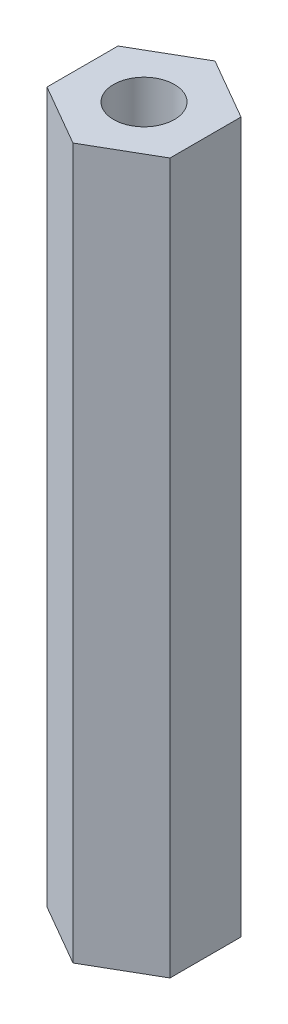
ISO-10303-21;
HEADER;
FILE_DESCRIPTION(('STEP AP214'),'2;1');
FILE_NAME('part.step','',(''),(''),'','','');
FILE_SCHEMA(('AUTOMOTIVE_DESIGN { 1 0 10303 214 1 1 1 1 }'));
ENDSEC;
DATA;
#1=APPLICATION_CONTEXT('core data for automotive mechanical design processes');
#2=APPLICATION_PROTOCOL_DEFINITION('international standard','automotive_design',2000,#1);
#3=PRODUCT_CONTEXT('',#1,'mechanical');
#4=PRODUCT('Part','Part','',(#3));
#5=PRODUCT_RELATED_PRODUCT_CATEGORY('part','',(#4));
#6=PRODUCT_DEFINITION_FORMATION('','',#4);
#7=PRODUCT_DEFINITION_CONTEXT('part definition',#1,'design');
#8=PRODUCT_DEFINITION('design','',#6,#7);
#9=PRODUCT_DEFINITION_SHAPE('','',#8);
#10=(LENGTH_UNIT() NAMED_UNIT(*) SI_UNIT(.MILLI.,.METRE.));
#11=(NAMED_UNIT(*) PLANE_ANGLE_UNIT() SI_UNIT($,.RADIAN.));
#12=(NAMED_UNIT(*) SI_UNIT($,.STERADIAN.) SOLID_ANGLE_UNIT());
#13=UNCERTAINTY_MEASURE_WITH_UNIT(LENGTH_MEASURE(1.E-05),#10,'distance_accuracy_value','');
#14=(GEOMETRIC_REPRESENTATION_CONTEXT(3) GLOBAL_UNCERTAINTY_ASSIGNED_CONTEXT((#13)) GLOBAL_UNIT_ASSIGNED_CONTEXT((#10,
#11,#12)) REPRESENTATION_CONTEXT('',''));
#15=CARTESIAN_POINT('',(0.,0.,0.));
#16=DIRECTION('',(0.,0.,1.));
#17=DIRECTION('',(1.,0.,0.));
#18=AXIS2_PLACEMENT_3D('',#15,#16,#17);
#19=CARTESIAN_POINT('',(1.51554445662276,35.,-2.62500000000002));
#20=DIRECTION('',(-0.499999999999995,0.,0.866025403784441));
#21=DIRECTION('',(0.866025403784442,0.,0.499999999999995));
#22=AXIS2_PLACEMENT_3D('',#19,#20,#21);
#23=PLANE('',#22);
#24=DIRECTION('',(-0.866025403784442,0.,-0.499999999999995));
#25=VECTOR('',#24,1.);
#26=CARTESIAN_POINT('',(1.51554445662276,0.,-2.62500000000002));
#27=LINE('',#26,#25);
#28=CARTESIAN_POINT('',(3.03108891324551,0.,-1.75000000000003));
#29=VERTEX_POINT('',#28);
#30=CARTESIAN_POINT('',(0.,0.,-3.5));
#31=VERTEX_POINT('',#30);
#32=EDGE_CURVE('E141',#29,#31,#27,.T.);
#33=ORIENTED_EDGE('',*,*,#32,.T.);
#34=DIRECTION('',(0.,-1.,0.));
#35=VECTOR('',#34,1.);
#36=CARTESIAN_POINT('',(0.,35.,-3.5));
#37=LINE('',#36,#35);
#38=CARTESIAN_POINT('',(0.,35.,-3.5));
#39=VERTEX_POINT('',#38);
#40=EDGE_CURVE('E11',#39,#31,#37,.T.);
#41=ORIENTED_EDGE('',*,*,#40,.F.);
#42=DIRECTION('',(-0.866025403784442,0.,-0.499999999999995));
#43=VECTOR('',#42,1.);
#44=CARTESIAN_POINT('',(1.51554445662276,35.,-2.62500000000002));
#45=LINE('',#44,#43);
#46=CARTESIAN_POINT('',(3.03108891324551,35.,-1.75000000000003));
#47=VERTEX_POINT('',#46);
#48=EDGE_CURVE('E161',#47,#39,#45,.T.);
#49=ORIENTED_EDGE('',*,*,#48,.F.);
#50=DIRECTION('',(0.,-1.,0.));
#51=VECTOR('',#50,1.);
#52=CARTESIAN_POINT('',(3.03108891324551,35.,-1.75000000000003));
#53=LINE('',#52,#51);
#54=EDGE_CURVE('E140',#47,#29,#53,.T.);
#55=ORIENTED_EDGE('',*,*,#54,.T.);
#56=EDGE_LOOP('',(#33,#41,#49,#55));
#57=FACE_BOUND('',#56,.T.);
#58=ADVANCED_FACE('F47',(#57),#23,.F.);
#59=CARTESIAN_POINT('',(-1.51554445662277,35.,-2.625));
#60=DIRECTION('',(0.500000000000001,0.,0.866025403784438));
#61=DIRECTION('',(0.866025403784438,0.,-0.500000000000001));
#62=AXIS2_PLACEMENT_3D('',#59,#60,#61);
#63=PLANE('',#62);
#64=DIRECTION('',(-0.866025403784438,0.,0.500000000000001));
#65=VECTOR('',#64,1.);
#66=CARTESIAN_POINT('',(-1.51554445662277,0.,-2.625));
#67=LINE('',#66,#65);
#68=CARTESIAN_POINT('',(-3.03108891324554,0.,-1.74999999999999));
#69=VERTEX_POINT('',#68);
#70=EDGE_CURVE('E145',#31,#69,#67,.T.);
#71=ORIENTED_EDGE('',*,*,#70,.T.);
#72=DIRECTION('',(0.,-1.,0.));
#73=VECTOR('',#72,1.);
#74=CARTESIAN_POINT('',(-3.03108891324554,35.,-1.74999999999999));
#75=LINE('',#74,#73);
#76=CARTESIAN_POINT('',(-3.03108891324554,35.,-1.74999999999999));
#77=VERTEX_POINT('',#76);
#78=EDGE_CURVE('E56',#77,#69,#75,.T.);
#79=ORIENTED_EDGE('',*,*,#78,.F.);
#80=DIRECTION('',(-0.866025403784438,0.,0.500000000000001));
#81=VECTOR('',#80,1.);
#82=CARTESIAN_POINT('',(-1.51554445662277,35.,-2.625));
#83=LINE('',#82,#81);
#84=EDGE_CURVE('E101',#39,#77,#83,.T.);
#85=ORIENTED_EDGE('',*,*,#84,.F.);
#86=ORIENTED_EDGE('',*,*,#40,.T.);
#87=EDGE_LOOP('',(#71,#79,#85,#86));
#88=FACE_BOUND('',#87,.T.);
#89=ADVANCED_FACE('F191',(#88),#63,.F.);
#90=CARTESIAN_POINT('',(-3.03108891324553,35.,0.));
#91=DIRECTION('',(1.,0.,0.));
#92=DIRECTION('',(0.,0.,-1.));
#93=AXIS2_PLACEMENT_3D('',#90,#91,#92);
#94=PLANE('',#93);
#95=DIRECTION('',(0.,0.,1.));
#96=VECTOR('',#95,1.);
#97=CARTESIAN_POINT('',(-3.03108891324553,0.,0.));
#98=LINE('',#97,#96);
#99=CARTESIAN_POINT('',(-3.03108891324553,0.,1.75000000000001));
#100=VERTEX_POINT('',#99);
#101=EDGE_CURVE('E148',#69,#100,#98,.T.);
#102=ORIENTED_EDGE('',*,*,#101,.T.);
#103=DIRECTION('',(0.,-1.,0.));
#104=VECTOR('',#103,1.);
#105=CARTESIAN_POINT('',(-3.03108891324553,35.,1.75000000000001));
#106=LINE('',#105,#104);
#107=CARTESIAN_POINT('',(-3.03108891324553,35.,1.75000000000001));
#108=VERTEX_POINT('',#107);
#109=EDGE_CURVE('E126',#108,#100,#106,.T.);
#110=ORIENTED_EDGE('',*,*,#109,.F.);
#111=DIRECTION('',(0.,0.,1.));
#112=VECTOR('',#111,1.);
#113=CARTESIAN_POINT('',(-3.03108891324553,35.,0.));
#114=LINE('',#113,#112);
#115=EDGE_CURVE('E115',#77,#108,#114,.T.);
#116=ORIENTED_EDGE('',*,*,#115,.F.);
#117=ORIENTED_EDGE('',*,*,#78,.T.);
#118=EDGE_LOOP('',(#102,#110,#116,#117));
#119=FACE_BOUND('',#118,.T.);
#120=ADVANCED_FACE('F171',(#119),#94,.F.);
#121=CARTESIAN_POINT('',(-1.51554445662275,35.,2.62500000000001));
#122=DIRECTION('',(0.499999999999995,0.,-0.866025403784441));
#123=DIRECTION('',(-0.866025403784442,0.,-0.499999999999995));
#124=AXIS2_PLACEMENT_3D('',#121,#122,#123);
#125=PLANE('',#124);
#126=DIRECTION('',(0.866025403784442,0.,0.499999999999995));
#127=VECTOR('',#126,1.);
#128=CARTESIAN_POINT('',(-1.51554445662275,0.,2.62500000000001));
#129=LINE('',#128,#127);
#130=CARTESIAN_POINT('',(0.,0.,3.5));
#131=VERTEX_POINT('',#130);
#132=EDGE_CURVE('E124',#100,#131,#129,.T.);
#133=ORIENTED_EDGE('',*,*,#132,.T.);
#134=DIRECTION('',(0.,-1.,0.));
#135=VECTOR('',#134,1.);
#136=CARTESIAN_POINT('',(0.,35.,3.5));
#137=LINE('',#136,#135);
#138=CARTESIAN_POINT('',(0.,35.,3.5));
#139=VERTEX_POINT('',#138);
#140=EDGE_CURVE('E121',#139,#131,#137,.T.);
#141=ORIENTED_EDGE('',*,*,#140,.F.);
#142=DIRECTION('',(0.866025403784442,0.,0.499999999999995));
#143=VECTOR('',#142,1.);
#144=CARTESIAN_POINT('',(-1.51554445662275,35.,2.62500000000001));
#145=LINE('',#144,#143);
#146=EDGE_CURVE('E108',#108,#139,#145,.T.);
#147=ORIENTED_EDGE('',*,*,#146,.F.);
#148=ORIENTED_EDGE('',*,*,#109,.T.);
#149=EDGE_LOOP('',(#133,#141,#147,#148));
#150=FACE_BOUND('',#149,.T.);
#151=ADVANCED_FACE('F122',(#150),#125,.F.);
#152=CARTESIAN_POINT('',(1.51554445662279,35.,2.62499999999999));
#153=DIRECTION('',(-0.500000000000007,0.,-0.866025403784435));
#154=DIRECTION('',(-0.866025403784435,0.,0.500000000000007));
#155=AXIS2_PLACEMENT_3D('',#152,#153,#154);
#156=PLANE('',#155);
#157=DIRECTION('',(0.866025403784435,0.,-0.500000000000007));
#158=VECTOR('',#157,1.);
#159=CARTESIAN_POINT('',(1.51554445662279,0.,2.62499999999999));
#160=LINE('',#159,#158);
#161=CARTESIAN_POINT('',(3.03108891324555,0.,1.74999999999997));
#162=VERTEX_POINT('',#161);
#163=EDGE_CURVE('E87',#131,#162,#160,.T.);
#164=ORIENTED_EDGE('',*,*,#163,.T.);
#165=DIRECTION('',(0.,-1.,0.));
#166=VECTOR('',#165,1.);
#167=CARTESIAN_POINT('',(3.03108891324555,35.,1.74999999999997));
#168=LINE('',#167,#166);
#169=CARTESIAN_POINT('',(3.03108891324555,35.,1.74999999999997));
#170=VERTEX_POINT('',#169);
#171=EDGE_CURVE('E127',#170,#162,#168,.T.);
#172=ORIENTED_EDGE('',*,*,#171,.F.);
#173=DIRECTION('',(0.866025403784435,0.,-0.500000000000007));
#174=VECTOR('',#173,1.);
#175=CARTESIAN_POINT('',(1.51554445662279,35.,2.62499999999999));
#176=LINE('',#175,#174);
#177=EDGE_CURVE('E113',#139,#170,#176,.T.);
#178=ORIENTED_EDGE('',*,*,#177,.F.);
#179=ORIENTED_EDGE('',*,*,#140,.T.);
#180=EDGE_LOOP('',(#164,#172,#178,#179));
#181=FACE_BOUND('',#180,.T.);
#182=ADVANCED_FACE('F129',(#181),#156,.F.);
#183=CARTESIAN_POINT('',(3.03108891324553,35.,0.));
#184=DIRECTION('',(-1.,0.,0.));
#185=DIRECTION('',(0.,0.,1.));
#186=AXIS2_PLACEMENT_3D('',#183,#184,#185);
#187=PLANE('',#186);
#188=DIRECTION('',(0.,0.,-1.));
#189=VECTOR('',#188,1.);
#190=CARTESIAN_POINT('',(3.03108891324553,0.,0.));
#191=LINE('',#190,#189);
#192=EDGE_CURVE('E93',#162,#29,#191,.T.);
#193=ORIENTED_EDGE('',*,*,#192,.T.);
#194=ORIENTED_EDGE('',*,*,#54,.F.);
#195=DIRECTION('',(0.,0.,-1.));
#196=VECTOR('',#195,1.);
#197=CARTESIAN_POINT('',(3.03108891324553,35.,0.));
#198=LINE('',#197,#196);
#199=EDGE_CURVE('E64',#170,#47,#198,.T.);
#200=ORIENTED_EDGE('',*,*,#199,.F.);
#201=ORIENTED_EDGE('',*,*,#171,.T.);
#202=EDGE_LOOP('',(#193,#194,#200,#201));
#203=FACE_BOUND('',#202,.T.);
#204=ADVANCED_FACE('F179',(#203),#187,.F.);
#205=CARTESIAN_POINT('',(0.,35.,0.));
#206=DIRECTION('',(0.,-1.,0.));
#207=DIRECTION('',(0.,0.,-1.));
#208=AXIS2_PLACEMENT_3D('',#205,#206,#207);
#209=CYLINDRICAL_SURFACE('',#208,1.5);
#210=CARTESIAN_POINT('',(0.,35.,0.));
#211=DIRECTION('',(0.,1.,0.));
#212=DIRECTION('',(0.,0.,1.));
#213=AXIS2_PLACEMENT_3D('',#210,#211,#212);
#214=CIRCLE('',#213,1.5);
#215=CARTESIAN_POINT('',(0.,35.,1.5));
#216=VERTEX_POINT('',#215);
#217=EDGE_CURVE('E133',#216,#216,#214,.T.);
#218=ORIENTED_EDGE('',*,*,#217,.T.);
#219=EDGE_LOOP('',(#218));
#220=FACE_BOUND('',#219,.T.);
#221=CARTESIAN_POINT('',(0.,0.,0.));
#222=DIRECTION('',(0.,1.,0.));
#223=DIRECTION('',(0.,0.,1.));
#224=AXIS2_PLACEMENT_3D('',#221,#222,#223);
#225=CIRCLE('',#224,1.5);
#226=CARTESIAN_POINT('',(0.,0.,1.5));
#227=VERTEX_POINT('',#226);
#228=EDGE_CURVE('E157',#227,#227,#225,.T.);
#229=ORIENTED_EDGE('',*,*,#228,.F.);
#230=EDGE_LOOP('',(#229));
#231=FACE_BOUND('',#230,.T.);
#232=ADVANCED_FACE('F181',(#220,#231),#209,.F.);
#233=CARTESIAN_POINT('',(0.,35.,0.));
#234=DIRECTION('',(0.,1.,0.));
#235=DIRECTION('',(0.,0.,1.));
#236=AXIS2_PLACEMENT_3D('',#233,#234,#235);
#237=PLANE('',#236);
#238=ORIENTED_EDGE('',*,*,#48,.T.);
#239=ORIENTED_EDGE('',*,*,#84,.T.);
#240=ORIENTED_EDGE('',*,*,#115,.T.);
#241=ORIENTED_EDGE('',*,*,#146,.T.);
#242=ORIENTED_EDGE('',*,*,#177,.T.);
#243=ORIENTED_EDGE('',*,*,#199,.T.);
#244=EDGE_LOOP('',(#238,#239,#240,#241,#242,#243));
#245=FACE_BOUND('',#244,.T.);
#246=ORIENTED_EDGE('',*,*,#217,.F.);
#247=EDGE_LOOP('',(#246));
#248=FACE_BOUND('',#247,.T.);
#249=ADVANCED_FACE('F110',(#245,#248),#237,.T.);
#250=CARTESIAN_POINT('',(0.,0.,0.));
#251=DIRECTION('',(0.,1.,0.));
#252=DIRECTION('',(0.,0.,1.));
#253=AXIS2_PLACEMENT_3D('',#250,#251,#252);
#254=PLANE('',#253);
#255=ORIENTED_EDGE('',*,*,#32,.F.);
#256=ORIENTED_EDGE('',*,*,#192,.F.);
#257=ORIENTED_EDGE('',*,*,#163,.F.);
#258=ORIENTED_EDGE('',*,*,#132,.F.);
#259=ORIENTED_EDGE('',*,*,#101,.F.);
#260=ORIENTED_EDGE('',*,*,#70,.F.);
#261=EDGE_LOOP('',(#255,#256,#257,#258,#259,#260));
#262=FACE_BOUND('',#261,.T.);
#263=ORIENTED_EDGE('',*,*,#228,.T.);
#264=EDGE_LOOP('',(#263));
#265=FACE_BOUND('',#264,.T.);
#266=ADVANCED_FACE('F174',(#262,#265),#254,.F.);
#267=CLOSED_SHELL('',(#58,#89,#120,#151,#182,#204,#232,#249,#266));
#268=MANIFOLD_SOLID_BREP('B2',#267);
#269=ADVANCED_BREP_SHAPE_REPRESENTATION('',(#18,#268),#14);
#270=SHAPE_DEFINITION_REPRESENTATION(#9,#269);
ENDSEC;
END-ISO-10303-21;
